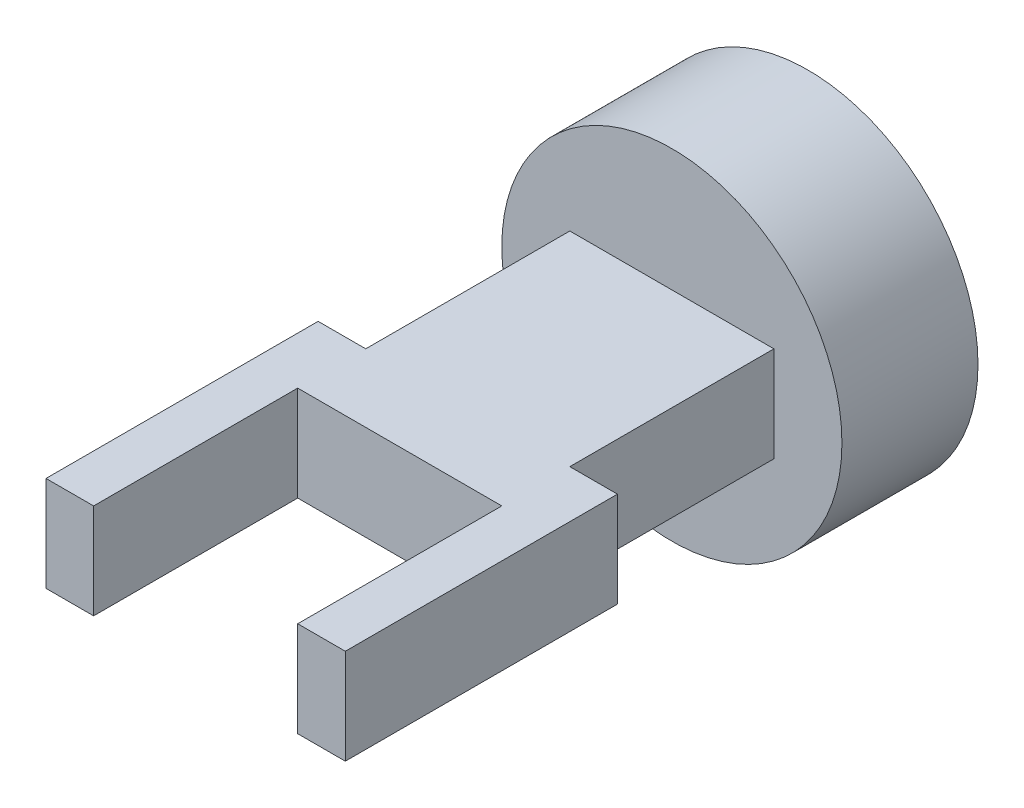
ISO-10303-21;
HEADER;
FILE_DESCRIPTION(('STEP AP214'),'2;1');
FILE_NAME('part.step','',(''),(''),'','','');
FILE_SCHEMA(('AUTOMOTIVE_DESIGN { 1 0 10303 214 1 1 1 1 }'));
ENDSEC;
DATA;
#1=APPLICATION_CONTEXT('core data for automotive mechanical design processes');
#2=APPLICATION_PROTOCOL_DEFINITION('international standard','automotive_design',2000,#1);
#3=PRODUCT_CONTEXT('',#1,'mechanical');
#4=PRODUCT('Part','Part','',(#3));
#5=PRODUCT_RELATED_PRODUCT_CATEGORY('part','',(#4));
#6=PRODUCT_DEFINITION_FORMATION('','',#4);
#7=PRODUCT_DEFINITION_CONTEXT('part definition',#1,'design');
#8=PRODUCT_DEFINITION('design','',#6,#7);
#9=PRODUCT_DEFINITION_SHAPE('','',#8);
#10=(LENGTH_UNIT() NAMED_UNIT(*) SI_UNIT(.MILLI.,.METRE.));
#11=(NAMED_UNIT(*) PLANE_ANGLE_UNIT() SI_UNIT($,.RADIAN.));
#12=(NAMED_UNIT(*) SI_UNIT($,.STERADIAN.) SOLID_ANGLE_UNIT());
#13=UNCERTAINTY_MEASURE_WITH_UNIT(LENGTH_MEASURE(1.E-05),#10,'distance_accuracy_value','');
#14=(GEOMETRIC_REPRESENTATION_CONTEXT(3) GLOBAL_UNCERTAINTY_ASSIGNED_CONTEXT((#13)) GLOBAL_UNIT_ASSIGNED_CONTEXT((#10,
#11,#12)) REPRESENTATION_CONTEXT('',''));
#15=CARTESIAN_POINT('',(0.,0.,0.));
#16=DIRECTION('',(0.,0.,1.));
#17=DIRECTION('',(1.,0.,0.));
#18=AXIS2_PLACEMENT_3D('',#15,#16,#17);
#19=CARTESIAN_POINT('',(7.5,-3.5,30.));
#20=DIRECTION('',(-1.,0.,0.));
#21=DIRECTION('',(0.,0.,1.));
#22=AXIS2_PLACEMENT_3D('',#19,#20,#21);
#23=PLANE('',#22);
#24=DIRECTION('',(0.,1.,0.));
#25=VECTOR('',#24,1.);
#26=CARTESIAN_POINT('',(7.5,0.,25.));
#27=LINE('',#26,#25);
#28=CARTESIAN_POINT('',(7.5,-3.5,25.));
#29=VERTEX_POINT('',#28);
#30=CARTESIAN_POINT('',(7.5,3.5,25.));
#31=VERTEX_POINT('',#30);
#32=EDGE_CURVE('E153',#29,#31,#27,.T.);
#33=ORIENTED_EDGE('',*,*,#32,.F.);
#34=DIRECTION('',(0.,0.,-1.));
#35=VECTOR('',#34,1.);
#36=CARTESIAN_POINT('',(7.5,-3.5,30.));
#37=LINE('',#36,#35);
#38=CARTESIAN_POINT('',(7.5,-3.5,10.));
#39=VERTEX_POINT('',#38);
#40=EDGE_CURVE('E267',#29,#39,#37,.T.);
#41=ORIENTED_EDGE('',*,*,#40,.T.);
#42=DIRECTION('',(0.,1.,0.));
#43=VECTOR('',#42,1.);
#44=CARTESIAN_POINT('',(7.5,-3.5,10.));
#45=LINE('',#44,#43);
#46=CARTESIAN_POINT('',(7.5,3.5,10.));
#47=VERTEX_POINT('',#46);
#48=EDGE_CURVE('E255',#39,#47,#45,.T.);
#49=ORIENTED_EDGE('',*,*,#48,.T.);
#50=DIRECTION('',(0.,0.,-1.));
#51=VECTOR('',#50,1.);
#52=CARTESIAN_POINT('',(7.5,3.5,30.));
#53=LINE('',#52,#51);
#54=EDGE_CURVE('E264',#31,#47,#53,.T.);
#55=ORIENTED_EDGE('',*,*,#54,.F.);
#56=EDGE_LOOP('',(#33,#41,#49,#55));
#57=FACE_BOUND('',#56,.T.);
#58=ADVANCED_FACE('F47',(#57),#23,.F.);
#59=CARTESIAN_POINT('',(0.,0.,30.));
#60=DIRECTION('',(0.,0.,1.));
#61=DIRECTION('',(1.,0.,0.));
#62=AXIS2_PLACEMENT_3D('',#59,#60,#61);
#63=PLANE('',#62);
#64=DIRECTION('',(0.,1.,0.));
#65=VECTOR('',#64,1.);
#66=CARTESIAN_POINT('',(7.5,0.,30.));
#67=LINE('',#66,#65);
#68=CARTESIAN_POINT('',(7.5,-3.5,30.));
#69=VERTEX_POINT('',#68);
#70=CARTESIAN_POINT('',(7.5,3.5,30.));
#71=VERTEX_POINT('',#70);
#72=EDGE_CURVE('E164',#69,#71,#67,.T.);
#73=ORIENTED_EDGE('',*,*,#72,.T.);
#74=DIRECTION('',(-1.,0.,0.));
#75=VECTOR('',#74,1.);
#76=CARTESIAN_POINT('',(7.5,3.5,30.));
#77=LINE('',#76,#75);
#78=CARTESIAN_POINT('',(-7.5,3.5,30.));
#79=VERTEX_POINT('',#78);
#80=EDGE_CURVE('E244',#71,#79,#77,.T.);
#81=ORIENTED_EDGE('',*,*,#80,.T.);
#82=DIRECTION('',(0.,-1.,0.));
#83=VECTOR('',#82,1.);
#84=CARTESIAN_POINT('',(-7.5,0.,30.));
#85=LINE('',#84,#83);
#86=CARTESIAN_POINT('',(-7.5,-3.5,30.));
#87=VERTEX_POINT('',#86);
#88=EDGE_CURVE('E194',#79,#87,#85,.T.);
#89=ORIENTED_EDGE('',*,*,#88,.T.);
#90=DIRECTION('',(1.,0.,0.));
#91=VECTOR('',#90,1.);
#92=CARTESIAN_POINT('',(7.5,-3.5,30.));
#93=LINE('',#92,#91);
#94=EDGE_CURVE('E240',#87,#69,#93,.T.);
#95=ORIENTED_EDGE('',*,*,#94,.T.);
#96=EDGE_LOOP('',(#73,#81,#89,#95));
#97=FACE_BOUND('',#96,.T.);
#98=ADVANCED_FACE('F292',(#97),#63,.T.);
#99=CARTESIAN_POINT('',(-7.5,-3.5,30.));
#100=DIRECTION('',(1.,0.,0.));
#101=DIRECTION('',(0.,0.,-1.));
#102=AXIS2_PLACEMENT_3D('',#99,#100,#101);
#103=PLANE('',#102);
#104=DIRECTION('',(0.,-1.,0.));
#105=VECTOR('',#104,1.);
#106=CARTESIAN_POINT('',(-7.5,0.,25.));
#107=LINE('',#106,#105);
#108=CARTESIAN_POINT('',(-7.5,3.5,25.));
#109=VERTEX_POINT('',#108);
#110=CARTESIAN_POINT('',(-7.5,-3.5,25.));
#111=VERTEX_POINT('',#110);
#112=EDGE_CURVE('E226',#109,#111,#107,.T.);
#113=ORIENTED_EDGE('',*,*,#112,.F.);
#114=DIRECTION('',(0.,0.,-1.));
#115=VECTOR('',#114,1.);
#116=CARTESIAN_POINT('',(-7.5,3.5,30.));
#117=LINE('',#116,#115);
#118=CARTESIAN_POINT('',(-7.5,3.5,10.));
#119=VERTEX_POINT('',#118);
#120=EDGE_CURVE('E248',#109,#119,#117,.T.);
#121=ORIENTED_EDGE('',*,*,#120,.T.);
#122=DIRECTION('',(0.,-1.,0.));
#123=VECTOR('',#122,1.);
#124=CARTESIAN_POINT('',(-7.5,-3.5,10.));
#125=LINE('',#124,#123);
#126=CARTESIAN_POINT('',(-7.5,-3.5,10.));
#127=VERTEX_POINT('',#126);
#128=EDGE_CURVE('E237',#119,#127,#125,.T.);
#129=ORIENTED_EDGE('',*,*,#128,.T.);
#130=DIRECTION('',(0.,0.,-1.));
#131=VECTOR('',#130,1.);
#132=CARTESIAN_POINT('',(-7.5,-3.5,30.));
#133=LINE('',#132,#131);
#134=EDGE_CURVE('E270',#111,#127,#133,.T.);
#135=ORIENTED_EDGE('',*,*,#134,.F.);
#136=EDGE_LOOP('',(#113,#121,#129,#135));
#137=FACE_BOUND('',#136,.T.);
#138=ADVANCED_FACE('F298',(#137),#103,.F.);
#139=CARTESIAN_POINT('',(0.,0.,10.));
#140=DIRECTION('',(0.,0.,-1.));
#141=DIRECTION('',(-1.,0.,0.));
#142=AXIS2_PLACEMENT_3D('',#139,#140,#141);
#143=CYLINDRICAL_SURFACE('',#142,12.5);
#144=CARTESIAN_POINT('',(0.,0.,10.));
#145=DIRECTION('',(0.,0.,1.));
#146=DIRECTION('',(1.,0.,0.));
#147=AXIS2_PLACEMENT_3D('',#144,#145,#146);
#148=CIRCLE('',#147,12.5);
#149=CARTESIAN_POINT('',(12.5,0.,10.));
#150=VERTEX_POINT('',#149);
#151=EDGE_CURVE('E11',#150,#150,#148,.T.);
#152=ORIENTED_EDGE('',*,*,#151,.F.);
#153=EDGE_LOOP('',(#152));
#154=FACE_BOUND('',#153,.T.);
#155=CARTESIAN_POINT('',(0.,0.,0.));
#156=DIRECTION('',(0.,0.,1.));
#157=DIRECTION('',(1.,0.,0.));
#158=AXIS2_PLACEMENT_3D('',#155,#156,#157);
#159=CIRCLE('',#158,12.5);
#160=CARTESIAN_POINT('',(12.5,0.,0.));
#161=VERTEX_POINT('',#160);
#162=EDGE_CURVE('E51',#161,#161,#159,.T.);
#163=ORIENTED_EDGE('',*,*,#162,.T.);
#164=EDGE_LOOP('',(#163));
#165=FACE_BOUND('',#164,.T.);
#166=ADVANCED_FACE('F49',(#154,#165),#143,.T.);
#167=CARTESIAN_POINT('',(0.,0.,10.));
#168=DIRECTION('',(0.,0.,1.));
#169=DIRECTION('',(1.,0.,0.));
#170=AXIS2_PLACEMENT_3D('',#167,#168,#169);
#171=PLANE('',#170);
#172=ORIENTED_EDGE('',*,*,#128,.F.);
#173=DIRECTION('',(-1.,0.,0.));
#174=VECTOR('',#173,1.);
#175=CARTESIAN_POINT('',(7.5,3.5,10.));
#176=LINE('',#175,#174);
#177=EDGE_CURVE('E245',#47,#119,#176,.T.);
#178=ORIENTED_EDGE('',*,*,#177,.F.);
#179=ORIENTED_EDGE('',*,*,#48,.F.);
#180=DIRECTION('',(1.,0.,0.));
#181=VECTOR('',#180,1.);
#182=CARTESIAN_POINT('',(7.5,-3.5,10.));
#183=LINE('',#182,#181);
#184=EDGE_CURVE('E252',#127,#39,#183,.T.);
#185=ORIENTED_EDGE('',*,*,#184,.F.);
#186=EDGE_LOOP('',(#172,#178,#179,#185));
#187=FACE_BOUND('',#186,.T.);
#188=ORIENTED_EDGE('',*,*,#151,.T.);
#189=EDGE_LOOP('',(#188));
#190=FACE_BOUND('',#189,.T.);
#191=ADVANCED_FACE('F281',(#187,#190),#171,.T.);
#192=CARTESIAN_POINT('',(0.,0.,0.));
#193=DIRECTION('',(0.,0.,1.));
#194=DIRECTION('',(1.,0.,0.));
#195=AXIS2_PLACEMENT_3D('',#192,#193,#194);
#196=PLANE('',#195);
#197=ORIENTED_EDGE('',*,*,#162,.F.);
#198=EDGE_LOOP('',(#197));
#199=FACE_BOUND('',#198,.T.);
#200=ADVANCED_FACE('F279',(#199),#196,.F.);
#201=CARTESIAN_POINT('',(7.5,-3.5,30.));
#202=DIRECTION('',(0.,1.,0.));
#203=DIRECTION('',(-1.,0.,0.));
#204=AXIS2_PLACEMENT_3D('',#201,#202,#203);
#205=PLANE('',#204);
#206=ORIENTED_EDGE('',*,*,#184,.T.);
#207=ORIENTED_EDGE('',*,*,#40,.F.);
#208=DIRECTION('',(-1.,0.,0.));
#209=VECTOR('',#208,1.);
#210=CARTESIAN_POINT('',(0.,-3.5,25.));
#211=LINE('',#210,#209);
#212=CARTESIAN_POINT('',(11.,-3.5,25.));
#213=VERTEX_POINT('',#212);
#214=EDGE_CURVE('E147',#213,#29,#211,.T.);
#215=ORIENTED_EDGE('',*,*,#214,.F.);
#216=DIRECTION('',(0.,0.,1.));
#217=VECTOR('',#216,1.);
#218=CARTESIAN_POINT('',(11.,-3.5,25.));
#219=LINE('',#218,#217);
#220=CARTESIAN_POINT('',(11.,-3.5,45.));
#221=VERTEX_POINT('',#220);
#222=EDGE_CURVE('E140',#213,#221,#219,.T.);
#223=ORIENTED_EDGE('',*,*,#222,.T.);
#224=DIRECTION('',(-1.,0.,0.));
#225=VECTOR('',#224,1.);
#226=CARTESIAN_POINT('',(0.,-3.5,45.));
#227=LINE('',#226,#225);
#228=CARTESIAN_POINT('',(7.5,-3.5,45.));
#229=VERTEX_POINT('',#228);
#230=EDGE_CURVE('E144',#221,#229,#227,.T.);
#231=ORIENTED_EDGE('',*,*,#230,.T.);
#232=DIRECTION('',(0.,0.,-1.));
#233=VECTOR('',#232,1.);
#234=CARTESIAN_POINT('',(7.5,-3.5,45.));
#235=LINE('',#234,#233);
#236=EDGE_CURVE('E175',#229,#69,#235,.T.);
#237=ORIENTED_EDGE('',*,*,#236,.T.);
#238=ORIENTED_EDGE('',*,*,#94,.F.);
#239=DIRECTION('',(0.,0.,-1.));
#240=VECTOR('',#239,1.);
#241=CARTESIAN_POINT('',(-7.5,-3.5,45.));
#242=LINE('',#241,#240);
#243=CARTESIAN_POINT('',(-7.5,-3.5,45.));
#244=VERTEX_POINT('',#243);
#245=EDGE_CURVE('E71',#244,#87,#242,.T.);
#246=ORIENTED_EDGE('',*,*,#245,.F.);
#247=DIRECTION('',(1.,0.,0.));
#248=VECTOR('',#247,1.);
#249=CARTESIAN_POINT('',(0.,-3.5,45.));
#250=LINE('',#249,#248);
#251=CARTESIAN_POINT('',(-11.,-3.5,45.));
#252=VERTEX_POINT('',#251);
#253=EDGE_CURVE('E200',#252,#244,#250,.T.);
#254=ORIENTED_EDGE('',*,*,#253,.F.);
#255=DIRECTION('',(0.,0.,1.));
#256=VECTOR('',#255,1.);
#257=CARTESIAN_POINT('',(-11.,-3.5,25.));
#258=LINE('',#257,#256);
#259=CARTESIAN_POINT('',(-11.,-3.5,25.));
#260=VERTEX_POINT('',#259);
#261=EDGE_CURVE('E233',#260,#252,#258,.T.);
#262=ORIENTED_EDGE('',*,*,#261,.F.);
#263=DIRECTION('',(1.,0.,0.));
#264=VECTOR('',#263,1.);
#265=CARTESIAN_POINT('',(0.,-3.5,25.));
#266=LINE('',#265,#264);
#267=EDGE_CURVE('E222',#260,#111,#266,.T.);
#268=ORIENTED_EDGE('',*,*,#267,.T.);
#269=ORIENTED_EDGE('',*,*,#134,.T.);
#270=EDGE_LOOP('',(#206,#207,#215,#223,#231,#237,#238,#246,#254,#262,#268,#269));
#271=FACE_BOUND('',#270,.T.);
#272=ADVANCED_FACE('F143',(#271),#205,.F.);
#273=CARTESIAN_POINT('',(7.5,3.5,30.));
#274=DIRECTION('',(0.,-1.,0.));
#275=DIRECTION('',(1.,0.,0.));
#276=AXIS2_PLACEMENT_3D('',#273,#274,#275);
#277=PLANE('',#276);
#278=ORIENTED_EDGE('',*,*,#177,.T.);
#279=ORIENTED_EDGE('',*,*,#120,.F.);
#280=DIRECTION('',(-1.,0.,0.));
#281=VECTOR('',#280,1.);
#282=CARTESIAN_POINT('',(0.,3.5,25.));
#283=LINE('',#282,#281);
#284=CARTESIAN_POINT('',(-11.,3.5,25.));
#285=VERTEX_POINT('',#284);
#286=EDGE_CURVE('E229',#109,#285,#283,.T.);
#287=ORIENTED_EDGE('',*,*,#286,.T.);
#288=DIRECTION('',(0.,0.,1.));
#289=VECTOR('',#288,1.);
#290=CARTESIAN_POINT('',(-11.,3.5,25.));
#291=LINE('',#290,#289);
#292=CARTESIAN_POINT('',(-11.,3.5,45.));
#293=VERTEX_POINT('',#292);
#294=EDGE_CURVE('E234',#285,#293,#291,.T.);
#295=ORIENTED_EDGE('',*,*,#294,.T.);
#296=DIRECTION('',(-1.,0.,0.));
#297=VECTOR('',#296,1.);
#298=CARTESIAN_POINT('',(0.,3.5,45.));
#299=LINE('',#298,#297);
#300=CARTESIAN_POINT('',(-7.5,3.5,45.));
#301=VERTEX_POINT('',#300);
#302=EDGE_CURVE('E206',#301,#293,#299,.T.);
#303=ORIENTED_EDGE('',*,*,#302,.F.);
#304=DIRECTION('',(0.,0.,-1.));
#305=VECTOR('',#304,1.);
#306=CARTESIAN_POINT('',(-7.5,3.5,45.));
#307=LINE('',#306,#305);
#308=EDGE_CURVE('E210',#301,#79,#307,.T.);
#309=ORIENTED_EDGE('',*,*,#308,.T.);
#310=ORIENTED_EDGE('',*,*,#80,.F.);
#311=DIRECTION('',(0.,0.,-1.));
#312=VECTOR('',#311,1.);
#313=CARTESIAN_POINT('',(7.5,3.5,45.));
#314=LINE('',#313,#312);
#315=CARTESIAN_POINT('',(7.5,3.5,45.));
#316=VERTEX_POINT('',#315);
#317=EDGE_CURVE('E181',#316,#71,#314,.T.);
#318=ORIENTED_EDGE('',*,*,#317,.F.);
#319=DIRECTION('',(1.,0.,0.));
#320=VECTOR('',#319,1.);
#321=CARTESIAN_POINT('',(0.,3.5,45.));
#322=LINE('',#321,#320);
#323=CARTESIAN_POINT('',(11.,3.5,45.));
#324=VERTEX_POINT('',#323);
#325=EDGE_CURVE('E168',#316,#324,#322,.T.);
#326=ORIENTED_EDGE('',*,*,#325,.T.);
#327=DIRECTION('',(0.,0.,1.));
#328=VECTOR('',#327,1.);
#329=CARTESIAN_POINT('',(11.,3.5,25.));
#330=LINE('',#329,#328);
#331=CARTESIAN_POINT('',(11.,3.5,25.));
#332=VERTEX_POINT('',#331);
#333=EDGE_CURVE('E152',#332,#324,#330,.T.);
#334=ORIENTED_EDGE('',*,*,#333,.F.);
#335=DIRECTION('',(1.,0.,0.));
#336=VECTOR('',#335,1.);
#337=CARTESIAN_POINT('',(0.,3.5,25.));
#338=LINE('',#337,#336);
#339=EDGE_CURVE('E63',#31,#332,#338,.T.);
#340=ORIENTED_EDGE('',*,*,#339,.F.);
#341=ORIENTED_EDGE('',*,*,#54,.T.);
#342=EDGE_LOOP('',(#278,#279,#287,#295,#303,#309,#310,#318,#326,#334,#340,#341));
#343=FACE_BOUND('',#342,.T.);
#344=ADVANCED_FACE('F287',(#343),#277,.F.);
#345=CARTESIAN_POINT('',(-11.,0.,25.));
#346=DIRECTION('',(-1.,0.,0.));
#347=DIRECTION('',(0.,0.,1.));
#348=AXIS2_PLACEMENT_3D('',#345,#346,#347);
#349=PLANE('',#348);
#350=ORIENTED_EDGE('',*,*,#261,.T.);
#351=DIRECTION('',(0.,-1.,0.));
#352=VECTOR('',#351,1.);
#353=CARTESIAN_POINT('',(-11.,0.,45.));
#354=LINE('',#353,#352);
#355=EDGE_CURVE('E196',#293,#252,#354,.T.);
#356=ORIENTED_EDGE('',*,*,#355,.F.);
#357=ORIENTED_EDGE('',*,*,#294,.F.);
#358=DIRECTION('',(0.,-1.,0.));
#359=VECTOR('',#358,1.);
#360=CARTESIAN_POINT('',(-11.,0.,25.));
#361=LINE('',#360,#359);
#362=EDGE_CURVE('E218',#285,#260,#361,.T.);
#363=ORIENTED_EDGE('',*,*,#362,.T.);
#364=EDGE_LOOP('',(#350,#356,#357,#363));
#365=FACE_BOUND('',#364,.T.);
#366=ADVANCED_FACE('F335',(#365),#349,.T.);
#367=CARTESIAN_POINT('',(0.,0.,25.));
#368=DIRECTION('',(0.,0.,1.));
#369=DIRECTION('',(1.,0.,0.));
#370=AXIS2_PLACEMENT_3D('',#367,#368,#369);
#371=PLANE('',#370);
#372=ORIENTED_EDGE('',*,*,#362,.F.);
#373=ORIENTED_EDGE('',*,*,#286,.F.);
#374=ORIENTED_EDGE('',*,*,#112,.T.);
#375=ORIENTED_EDGE('',*,*,#267,.F.);
#376=EDGE_LOOP('',(#372,#373,#374,#375));
#377=FACE_BOUND('',#376,.T.);
#378=ADVANCED_FACE('F334',(#377),#371,.F.);
#379=CARTESIAN_POINT('',(-7.5,0.,45.));
#380=DIRECTION('',(1.,0.,0.));
#381=DIRECTION('',(0.,0.,-1.));
#382=AXIS2_PLACEMENT_3D('',#379,#380,#381);
#383=PLANE('',#382);
#384=ORIENTED_EDGE('',*,*,#88,.F.);
#385=ORIENTED_EDGE('',*,*,#308,.F.);
#386=DIRECTION('',(0.,-1.,0.));
#387=VECTOR('',#386,1.);
#388=CARTESIAN_POINT('',(-7.5,0.,45.));
#389=LINE('',#388,#387);
#390=EDGE_CURVE('E203',#301,#244,#389,.T.);
#391=ORIENTED_EDGE('',*,*,#390,.T.);
#392=ORIENTED_EDGE('',*,*,#245,.T.);
#393=EDGE_LOOP('',(#384,#385,#391,#392));
#394=FACE_BOUND('',#393,.T.);
#395=ADVANCED_FACE('F326',(#394),#383,.T.);
#396=CARTESIAN_POINT('',(0.,0.,45.));
#397=DIRECTION('',(0.,0.,1.));
#398=DIRECTION('',(1.,0.,0.));
#399=AXIS2_PLACEMENT_3D('',#396,#397,#398);
#400=PLANE('',#399);
#401=ORIENTED_EDGE('',*,*,#355,.T.);
#402=ORIENTED_EDGE('',*,*,#253,.T.);
#403=ORIENTED_EDGE('',*,*,#390,.F.);
#404=ORIENTED_EDGE('',*,*,#302,.T.);
#405=EDGE_LOOP('',(#401,#402,#403,#404));
#406=FACE_BOUND('',#405,.T.);
#407=ADVANCED_FACE('F331',(#406),#400,.T.);
#408=CARTESIAN_POINT('',(11.,0.,25.));
#409=DIRECTION('',(-1.,0.,0.));
#410=DIRECTION('',(0.,0.,1.));
#411=AXIS2_PLACEMENT_3D('',#408,#409,#410);
#412=PLANE('',#411);
#413=ORIENTED_EDGE('',*,*,#333,.T.);
#414=DIRECTION('',(0.,-1.,0.));
#415=VECTOR('',#414,1.);
#416=CARTESIAN_POINT('',(11.,0.,45.));
#417=LINE('',#416,#415);
#418=EDGE_CURVE('E159',#324,#221,#417,.T.);
#419=ORIENTED_EDGE('',*,*,#418,.T.);
#420=ORIENTED_EDGE('',*,*,#222,.F.);
#421=DIRECTION('',(0.,-1.,0.));
#422=VECTOR('',#421,1.);
#423=CARTESIAN_POINT('',(11.,0.,25.));
#424=LINE('',#423,#422);
#425=EDGE_CURVE('E186',#332,#213,#424,.T.);
#426=ORIENTED_EDGE('',*,*,#425,.F.);
#427=EDGE_LOOP('',(#413,#419,#420,#426));
#428=FACE_BOUND('',#427,.T.);
#429=ADVANCED_FACE('F166',(#428),#412,.F.);
#430=CARTESIAN_POINT('',(0.,0.,25.));
#431=DIRECTION('',(0.,0.,1.));
#432=DIRECTION('',(1.,0.,0.));
#433=AXIS2_PLACEMENT_3D('',#430,#431,#432);
#434=PLANE('',#433);
#435=ORIENTED_EDGE('',*,*,#214,.T.);
#436=ORIENTED_EDGE('',*,*,#32,.T.);
#437=ORIENTED_EDGE('',*,*,#339,.T.);
#438=ORIENTED_EDGE('',*,*,#425,.T.);
#439=EDGE_LOOP('',(#435,#436,#437,#438));
#440=FACE_BOUND('',#439,.T.);
#441=ADVANCED_FACE('F319',(#440),#434,.F.);
#442=CARTESIAN_POINT('',(7.5,0.,45.));
#443=DIRECTION('',(-1.,0.,0.));
#444=DIRECTION('',(0.,0.,1.));
#445=AXIS2_PLACEMENT_3D('',#442,#443,#444);
#446=PLANE('',#445);
#447=ORIENTED_EDGE('',*,*,#72,.F.);
#448=ORIENTED_EDGE('',*,*,#236,.F.);
#449=DIRECTION('',(0.,1.,0.));
#450=VECTOR('',#449,1.);
#451=CARTESIAN_POINT('',(7.5,0.,45.));
#452=LINE('',#451,#450);
#453=EDGE_CURVE('E162',#229,#316,#452,.T.);
#454=ORIENTED_EDGE('',*,*,#453,.T.);
#455=ORIENTED_EDGE('',*,*,#317,.T.);
#456=EDGE_LOOP('',(#447,#448,#454,#455));
#457=FACE_BOUND('',#456,.T.);
#458=ADVANCED_FACE('F323',(#457),#446,.T.);
#459=CARTESIAN_POINT('',(0.,0.,45.));
#460=DIRECTION('',(0.,0.,1.));
#461=DIRECTION('',(1.,0.,0.));
#462=AXIS2_PLACEMENT_3D('',#459,#460,#461);
#463=PLANE('',#462);
#464=ORIENTED_EDGE('',*,*,#230,.F.);
#465=ORIENTED_EDGE('',*,*,#418,.F.);
#466=ORIENTED_EDGE('',*,*,#325,.F.);
#467=ORIENTED_EDGE('',*,*,#453,.F.);
#468=EDGE_LOOP('',(#464,#465,#466,#467));
#469=FACE_BOUND('',#468,.T.);
#470=ADVANCED_FACE('F157',(#469),#463,.T.);
#471=CLOSED_SHELL('',(#58,#98,#138,#166,#191,#200,#272,#344,#366,#378,#395,#407,#429,#441,#458,#470));
#472=MANIFOLD_SOLID_BREP('B2',#471);
#473=ADVANCED_BREP_SHAPE_REPRESENTATION('',(#18,#472),#14);
#474=SHAPE_DEFINITION_REPRESENTATION(#9,#473);
ENDSEC;
END-ISO-10303-21;
